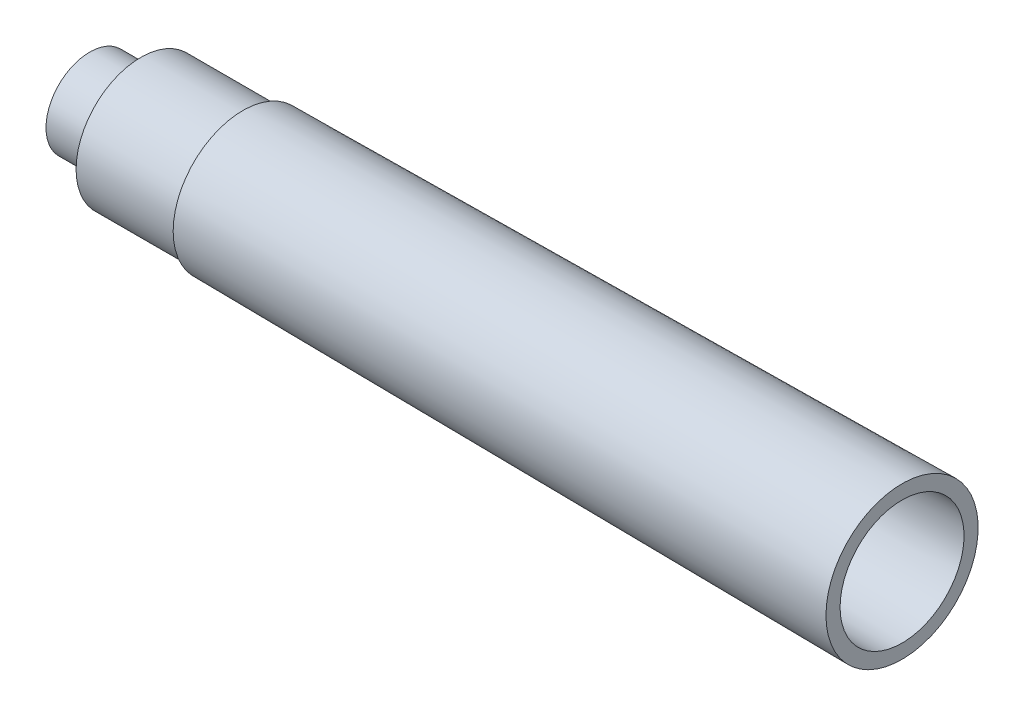
ISO-10303-21;
HEADER;
FILE_DESCRIPTION(('STEP AP214'),'2;1');
FILE_NAME('part.step','',(''),(''),'','','');
FILE_SCHEMA(('AUTOMOTIVE_DESIGN { 1 0 10303 214 1 1 1 1 }'));
ENDSEC;
DATA;
#1=APPLICATION_CONTEXT('core data for automotive mechanical design processes');
#2=APPLICATION_PROTOCOL_DEFINITION('international standard','automotive_design',2000,#1);
#3=PRODUCT_CONTEXT('',#1,'mechanical');
#4=PRODUCT('Part','Part','',(#3));
#5=PRODUCT_RELATED_PRODUCT_CATEGORY('part','',(#4));
#6=PRODUCT_DEFINITION_FORMATION('','',#4);
#7=PRODUCT_DEFINITION_CONTEXT('part definition',#1,'design');
#8=PRODUCT_DEFINITION('design','',#6,#7);
#9=PRODUCT_DEFINITION_SHAPE('','',#8);
#10=(LENGTH_UNIT() NAMED_UNIT(*) SI_UNIT(.MILLI.,.METRE.));
#11=(NAMED_UNIT(*) PLANE_ANGLE_UNIT() SI_UNIT($,.RADIAN.));
#12=(NAMED_UNIT(*) SI_UNIT($,.STERADIAN.) SOLID_ANGLE_UNIT());
#13=UNCERTAINTY_MEASURE_WITH_UNIT(LENGTH_MEASURE(1.E-05),#10,'distance_accuracy_value','');
#14=(GEOMETRIC_REPRESENTATION_CONTEXT(3) GLOBAL_UNCERTAINTY_ASSIGNED_CONTEXT((#13)) GLOBAL_UNIT_ASSIGNED_CONTEXT((#10,
#11,#12)) REPRESENTATION_CONTEXT('',''));
#15=CARTESIAN_POINT('',(0.,0.,0.));
#16=DIRECTION('',(0.,0.,1.));
#17=DIRECTION('',(1.,0.,0.));
#18=AXIS2_PLACEMENT_3D('',#15,#16,#17);
#19=CARTESIAN_POINT('',(0.465967208147707,5.75623065653714,0.));
#20=DIRECTION('',(1.,0.,0.));
#21=DIRECTION('',(0.,0.,-1.));
#22=AXIS2_PLACEMENT_3D('',#19,#20,#21);
#23=PLANE('',#22);
#24=CARTESIAN_POINT('',(0.465967208147707,3.58778917904093,0.));
#25=DIRECTION('',(-1.,0.,0.));
#26=DIRECTION('',(0.,0.,1.));
#27=AXIS2_PLACEMENT_3D('',#24,#25,#26);
#28=CIRCLE('',#27,1.81844147749621);
#29=CARTESIAN_POINT('',(0.465967208147707,3.58778917904093,1.81844147749621));
#30=VERTEX_POINT('',#29);
#31=EDGE_CURVE('E10',#30,#30,#28,.T.);
#32=ORIENTED_EDGE('',*,*,#31,.F.);
#33=EDGE_LOOP('',(#32));
#34=FACE_BOUND('',#33,.T.);
#35=CARTESIAN_POINT('',(0.465967208147706,3.58778917904093,0.));
#36=DIRECTION('',(-1.,0.,0.));
#37=DIRECTION('',(0.,0.,1.));
#38=AXIS2_PLACEMENT_3D('',#35,#36,#37);
#39=CIRCLE('',#38,2.16844147749621);
#40=CARTESIAN_POINT('',(0.465967208147706,3.58778917904093,2.16844147749621));
#41=VERTEX_POINT('',#40);
#42=EDGE_CURVE('E80',#41,#41,#39,.T.);
#43=ORIENTED_EDGE('',*,*,#42,.T.);
#44=EDGE_LOOP('',(#43));
#45=FACE_BOUND('',#44,.T.);
#46=ADVANCED_FACE('F28',(#34,#45),#23,.F.);
#47=CARTESIAN_POINT('',(0.883875689553689,3.58778917904093,0.));
#48=DIRECTION('',(-1.,0.,0.));
#49=DIRECTION('',(0.,0.,1.));
#50=AXIS2_PLACEMENT_3D('',#47,#48,#49);
#51=CYLINDRICAL_SURFACE('',#50,1.81844147749621);
#52=CARTESIAN_POINT('',(2.24662073761667,3.58778917904093,0.));
#53=DIRECTION('',(-1.,0.,0.));
#54=DIRECTION('',(0.,0.,1.));
#55=AXIS2_PLACEMENT_3D('',#52,#53,#54);
#56=CIRCLE('',#55,1.81844147749621);
#57=CARTESIAN_POINT('',(2.24662073761667,3.58778917904093,1.81844147749621));
#58=VERTEX_POINT('',#57);
#59=EDGE_CURVE('E34',#58,#58,#56,.T.);
#60=ORIENTED_EDGE('',*,*,#59,.F.);
#61=EDGE_LOOP('',(#60));
#62=FACE_BOUND('',#61,.T.);
#63=ORIENTED_EDGE('',*,*,#31,.T.);
#64=EDGE_LOOP('',(#63));
#65=FACE_BOUND('',#64,.T.);
#66=ADVANCED_FACE('F165',(#62,#65),#51,.F.);
#67=CARTESIAN_POINT('',(2.24662073761667,5.40623065653714,0.));
#68=DIRECTION('',(1.,0.,0.));
#69=DIRECTION('',(0.,0.,-1.));
#70=AXIS2_PLACEMENT_3D('',#67,#68,#69);
#71=PLANE('',#70);
#72=CARTESIAN_POINT('',(2.24662073761667,3.58778917904093,0.));
#73=DIRECTION('',(-1.,0.,0.));
#74=DIRECTION('',(0.,0.,1.));
#75=AXIS2_PLACEMENT_3D('',#72,#73,#74);
#76=CIRCLE('',#75,1.525);
#77=CARTESIAN_POINT('',(2.24662073761667,3.58778917904093,1.525));
#78=VERTEX_POINT('',#77);
#79=EDGE_CURVE('E38',#78,#78,#76,.T.);
#80=ORIENTED_EDGE('',*,*,#79,.F.);
#81=EDGE_LOOP('',(#80));
#82=FACE_BOUND('',#81,.T.);
#83=ORIENTED_EDGE('',*,*,#59,.T.);
#84=EDGE_LOOP('',(#83));
#85=FACE_BOUND('',#84,.T.);
#86=ADVANCED_FACE('F160',(#82,#85),#71,.F.);
#87=CARTESIAN_POINT('',(0.883875689553689,3.58778917904093,0.));
#88=DIRECTION('',(-1.,0.,0.));
#89=DIRECTION('',(0.,0.,1.));
#90=AXIS2_PLACEMENT_3D('',#87,#88,#89);
#91=CYLINDRICAL_SURFACE('',#90,1.525);
#92=CARTESIAN_POINT('',(0.883875689553689,3.58778917904093,0.));
#93=DIRECTION('',(-1.,0.,0.));
#94=DIRECTION('',(0.,0.,1.));
#95=AXIS2_PLACEMENT_3D('',#92,#93,#94);
#96=CIRCLE('',#95,1.525);
#97=CARTESIAN_POINT('',(0.883875689553689,3.58778917904093,1.525));
#98=VERTEX_POINT('',#97);
#99=EDGE_CURVE('E42',#98,#98,#96,.T.);
#100=ORIENTED_EDGE('',*,*,#99,.F.);
#101=EDGE_LOOP('',(#100));
#102=FACE_BOUND('',#101,.T.);
#103=ORIENTED_EDGE('',*,*,#79,.T.);
#104=EDGE_LOOP('',(#103));
#105=FACE_BOUND('',#104,.T.);
#106=ADVANCED_FACE('F154',(#102,#105),#91,.T.);
#107=CARTESIAN_POINT('',(0.883875689553689,5.11278917904093,0.));
#108=DIRECTION('',(1.,0.,0.));
#109=DIRECTION('',(0.,0.,-1.));
#110=AXIS2_PLACEMENT_3D('',#107,#108,#109);
#111=PLANE('',#110);
#112=CARTESIAN_POINT('',(0.883875689553689,3.58778917904093,0.));
#113=DIRECTION('',(-1.,0.,0.));
#114=DIRECTION('',(0.,0.,1.));
#115=AXIS2_PLACEMENT_3D('',#112,#113,#114);
#116=CIRCLE('',#115,1.175);
#117=CARTESIAN_POINT('',(0.883875689553689,3.58778917904093,1.175));
#118=VERTEX_POINT('',#117);
#119=EDGE_CURVE('E47',#118,#118,#116,.T.);
#120=ORIENTED_EDGE('',*,*,#119,.F.);
#121=EDGE_LOOP('',(#120));
#122=FACE_BOUND('',#121,.T.);
#123=ORIENTED_EDGE('',*,*,#99,.T.);
#124=EDGE_LOOP('',(#123));
#125=FACE_BOUND('',#124,.T.);
#126=ADVANCED_FACE('F148',(#122,#125),#111,.F.);
#127=CARTESIAN_POINT('',(0.883875689553689,3.58778917904093,0.));
#128=DIRECTION('',(-1.,0.,0.));
#129=DIRECTION('',(0.,0.,1.));
#130=AXIS2_PLACEMENT_3D('',#127,#128,#129);
#131=CYLINDRICAL_SURFACE('',#130,1.175);
#132=CARTESIAN_POINT('',(2.91007376605423,3.58778917904093,0.));
#133=DIRECTION('',(-1.,0.,0.));
#134=DIRECTION('',(0.,0.,1.));
#135=AXIS2_PLACEMENT_3D('',#132,#133,#134);
#136=CIRCLE('',#135,1.175);
#137=CARTESIAN_POINT('',(2.91007376605423,3.58778917904093,1.175));
#138=VERTEX_POINT('',#137);
#139=EDGE_CURVE('E50',#138,#138,#136,.T.);
#140=ORIENTED_EDGE('',*,*,#139,.F.);
#141=EDGE_LOOP('',(#140));
#142=FACE_BOUND('',#141,.T.);
#143=ORIENTED_EDGE('',*,*,#119,.T.);
#144=EDGE_LOOP('',(#143));
#145=FACE_BOUND('',#144,.T.);
#146=ADVANCED_FACE('F142',(#142,#145),#131,.F.);
#147=CARTESIAN_POINT('',(2.91007376605423,3.58778917904093,0.));
#148=DIRECTION('',(1.,0.,0.));
#149=DIRECTION('',(0.,0.,-1.));
#150=AXIS2_PLACEMENT_3D('',#147,#148,#149);
#151=CONICAL_SURFACE('',#150,1.175,1.17566067826737);
#152=CARTESIAN_POINT('',(3.46686364129525,3.58778917904093,0.));
#153=DIRECTION('',(-1.,0.,0.));
#154=DIRECTION('',(0.,0.,1.));
#155=AXIS2_PLACEMENT_3D('',#152,#153,#154);
#156=CIRCLE('',#155,2.51);
#157=CARTESIAN_POINT('',(3.46686364129525,3.58778917904093,2.51));
#158=VERTEX_POINT('',#157);
#159=EDGE_CURVE('E53',#158,#158,#156,.T.);
#160=ORIENTED_EDGE('',*,*,#159,.F.);
#161=EDGE_LOOP('',(#160));
#162=FACE_BOUND('',#161,.T.);
#163=ORIENTED_EDGE('',*,*,#139,.T.);
#164=EDGE_LOOP('',(#163));
#165=FACE_BOUND('',#164,.T.);
#166=ADVANCED_FACE('F136',(#162,#165),#151,.F.);
#167=CARTESIAN_POINT('',(0.883875689553689,3.58778917904093,0.));
#168=DIRECTION('',(-1.,0.,0.));
#169=DIRECTION('',(0.,0.,1.));
#170=AXIS2_PLACEMENT_3D('',#167,#168,#169);
#171=CYLINDRICAL_SURFACE('',#170,2.51);
#172=CARTESIAN_POINT('',(8.76596720814771,3.58778917904093,0.));
#173=DIRECTION('',(-1.,0.,0.));
#174=DIRECTION('',(0.,0.,1.));
#175=AXIS2_PLACEMENT_3D('',#172,#173,#174);
#176=CIRCLE('',#175,2.51);
#177=CARTESIAN_POINT('',(8.76596720814771,3.58778917904093,2.51));
#178=VERTEX_POINT('',#177);
#179=EDGE_CURVE('E56',#178,#178,#176,.T.);
#180=ORIENTED_EDGE('',*,*,#179,.F.);
#181=EDGE_LOOP('',(#180));
#182=FACE_BOUND('',#181,.T.);
#183=ORIENTED_EDGE('',*,*,#159,.T.);
#184=EDGE_LOOP('',(#183));
#185=FACE_BOUND('',#184,.T.);
#186=ADVANCED_FACE('F130',(#182,#185),#171,.F.);
#187=CARTESIAN_POINT('',(8.7659672081477,6.09778917904093,0.));
#188=DIRECTION('',(-1.,0.,0.));
#189=DIRECTION('',(0.,0.,1.));
#190=AXIS2_PLACEMENT_3D('',#187,#188,#189);
#191=PLANE('',#190);
#192=CARTESIAN_POINT('',(8.7659672081477,3.58778917904093,0.));
#193=DIRECTION('',(-1.,0.,0.));
#194=DIRECTION('',(0.,0.,1.));
#195=AXIS2_PLACEMENT_3D('',#192,#193,#194);
#196=CIRCLE('',#195,2.76);
#197=CARTESIAN_POINT('',(8.7659672081477,3.58778917904093,2.76));
#198=VERTEX_POINT('',#197);
#199=EDGE_CURVE('E59',#198,#198,#196,.T.);
#200=ORIENTED_EDGE('',*,*,#199,.F.);
#201=EDGE_LOOP('',(#200));
#202=FACE_BOUND('',#201,.T.);
#203=ORIENTED_EDGE('',*,*,#179,.T.);
#204=EDGE_LOOP('',(#203));
#205=FACE_BOUND('',#204,.T.);
#206=ADVANCED_FACE('F124',(#202,#205),#191,.F.);
#207=CARTESIAN_POINT('',(8.7659672081477,3.58778917904093,0.));
#208=DIRECTION('',(1.,0.,0.));
#209=DIRECTION('',(0.,0.,-1.));
#210=AXIS2_PLACEMENT_3D('',#207,#208,#209);
#211=CONICAL_SURFACE('',#210,2.76,0.00984343206728188);
#212=CARTESIAN_POINT('',(40.7659672081477,3.58778917904093,0.));
#213=DIRECTION('',(-1.,0.,0.));
#214=DIRECTION('',(0.,0.,1.));
#215=AXIS2_PLACEMENT_3D('',#212,#213,#214);
#216=CIRCLE('',#215,3.075);
#217=CARTESIAN_POINT('',(40.7659672081477,3.58778917904093,3.075));
#218=VERTEX_POINT('',#217);
#219=EDGE_CURVE('E62',#218,#218,#216,.T.);
#220=ORIENTED_EDGE('',*,*,#219,.F.);
#221=EDGE_LOOP('',(#220));
#222=FACE_BOUND('',#221,.T.);
#223=ORIENTED_EDGE('',*,*,#199,.T.);
#224=EDGE_LOOP('',(#223));
#225=FACE_BOUND('',#224,.T.);
#226=ADVANCED_FACE('F118',(#222,#225),#211,.F.);
#227=CARTESIAN_POINT('',(40.7659672081477,7.36278917904093,0.));
#228=DIRECTION('',(-1.,0.,0.));
#229=DIRECTION('',(0.,0.,1.));
#230=AXIS2_PLACEMENT_3D('',#227,#228,#229);
#231=PLANE('',#230);
#232=CARTESIAN_POINT('',(40.7659672081477,3.58778917904093,0.));
#233=DIRECTION('',(-1.,0.,0.));
#234=DIRECTION('',(0.,0.,1.));
#235=AXIS2_PLACEMENT_3D('',#232,#233,#234);
#236=CIRCLE('',#235,3.775);
#237=CARTESIAN_POINT('',(40.7659672081477,3.58778917904093,3.775));
#238=VERTEX_POINT('',#237);
#239=EDGE_CURVE('E65',#238,#238,#236,.T.);
#240=ORIENTED_EDGE('',*,*,#239,.F.);
#241=EDGE_LOOP('',(#240));
#242=FACE_BOUND('',#241,.T.);
#243=ORIENTED_EDGE('',*,*,#219,.T.);
#244=EDGE_LOOP('',(#243));
#245=FACE_BOUND('',#244,.T.);
#246=ADVANCED_FACE('F112',(#242,#245),#231,.F.);
#247=CARTESIAN_POINT('',(40.7659672081477,3.58778917904093,0.));
#248=DIRECTION('',(1.,0.,0.));
#249=DIRECTION('',(0.,0.,-1.));
#250=AXIS2_PLACEMENT_3D('',#247,#248,#249);
#251=CONICAL_SURFACE('',#250,3.775,0.0096327295732242);
#252=CARTESIAN_POINT('',(8.0659672081477,3.58778917904093,0.));
#253=DIRECTION('',(-1.,0.,0.));
#254=DIRECTION('',(0.,0.,1.));
#255=AXIS2_PLACEMENT_3D('',#252,#253,#254);
#256=CIRCLE('',#255,3.46);
#257=CARTESIAN_POINT('',(8.0659672081477,3.58778917904093,3.46));
#258=VERTEX_POINT('',#257);
#259=EDGE_CURVE('E68',#258,#258,#256,.T.);
#260=ORIENTED_EDGE('',*,*,#259,.F.);
#261=EDGE_LOOP('',(#260));
#262=FACE_BOUND('',#261,.T.);
#263=ORIENTED_EDGE('',*,*,#239,.T.);
#264=EDGE_LOOP('',(#263));
#265=FACE_BOUND('',#264,.T.);
#266=ADVANCED_FACE('F106',(#262,#265),#251,.T.);
#267=CARTESIAN_POINT('',(8.0659672081477,6.79778917904093,0.));
#268=DIRECTION('',(1.,0.,0.));
#269=DIRECTION('',(0.,0.,-1.));
#270=AXIS2_PLACEMENT_3D('',#267,#268,#269);
#271=PLANE('',#270);
#272=CARTESIAN_POINT('',(8.06596720814771,3.58778917904093,0.));
#273=DIRECTION('',(-1.,0.,0.));
#274=DIRECTION('',(0.,0.,1.));
#275=AXIS2_PLACEMENT_3D('',#272,#273,#274);
#276=CIRCLE('',#275,3.21);
#277=CARTESIAN_POINT('',(8.06596720814771,3.58778917904093,3.21));
#278=VERTEX_POINT('',#277);
#279=EDGE_CURVE('E71',#278,#278,#276,.T.);
#280=ORIENTED_EDGE('',*,*,#279,.F.);
#281=EDGE_LOOP('',(#280));
#282=FACE_BOUND('',#281,.T.);
#283=ORIENTED_EDGE('',*,*,#259,.T.);
#284=EDGE_LOOP('',(#283));
#285=FACE_BOUND('',#284,.T.);
#286=ADVANCED_FACE('F100',(#282,#285),#271,.F.);
#287=CARTESIAN_POINT('',(0.883875689553689,3.58778917904093,0.));
#288=DIRECTION('',(-1.,0.,0.));
#289=DIRECTION('',(0.,0.,1.));
#290=AXIS2_PLACEMENT_3D('',#287,#288,#289);
#291=CYLINDRICAL_SURFACE('',#290,3.21);
#292=CARTESIAN_POINT('',(3.00037113309236,3.58778917904093,0.));
#293=DIRECTION('',(-1.,0.,0.));
#294=DIRECTION('',(0.,0.,1.));
#295=AXIS2_PLACEMENT_3D('',#292,#293,#294);
#296=CIRCLE('',#295,3.21);
#297=CARTESIAN_POINT('',(3.00037113309236,3.58778917904093,3.21));
#298=VERTEX_POINT('',#297);
#299=EDGE_CURVE('E74',#298,#298,#296,.T.);
#300=ORIENTED_EDGE('',*,*,#299,.F.);
#301=EDGE_LOOP('',(#300));
#302=FACE_BOUND('',#301,.T.);
#303=ORIENTED_EDGE('',*,*,#279,.T.);
#304=EDGE_LOOP('',(#303));
#305=FACE_BOUND('',#304,.T.);
#306=ADVANCED_FACE('F94',(#302,#305),#291,.T.);
#307=CARTESIAN_POINT('',(3.00037113309236,3.58778917904093,0.));
#308=DIRECTION('',(1.,0.,0.));
#309=DIRECTION('',(0.,0.,-1.));
#310=AXIS2_PLACEMENT_3D('',#307,#308,#309);
#311=CONICAL_SURFACE('',#310,3.21,1.17566067826737);
#312=CARTESIAN_POINT('',(2.56596720814771,3.58778917904093,0.));
#313=DIRECTION('',(-1.,0.,0.));
#314=DIRECTION('',(0.,0.,1.));
#315=AXIS2_PLACEMENT_3D('',#312,#313,#314);
#316=CIRCLE('',#315,2.16844147749621);
#317=CARTESIAN_POINT('',(2.56596720814771,3.58778917904093,2.16844147749621));
#318=VERTEX_POINT('',#317);
#319=EDGE_CURVE('E77',#318,#318,#316,.T.);
#320=ORIENTED_EDGE('',*,*,#319,.F.);
#321=EDGE_LOOP('',(#320));
#322=FACE_BOUND('',#321,.T.);
#323=ORIENTED_EDGE('',*,*,#299,.T.);
#324=EDGE_LOOP('',(#323));
#325=FACE_BOUND('',#324,.T.);
#326=ADVANCED_FACE('F88',(#322,#325),#311,.T.);
#327=CARTESIAN_POINT('',(0.883875689553689,3.58778917904093,0.));
#328=DIRECTION('',(-1.,0.,0.));
#329=DIRECTION('',(0.,0.,1.));
#330=AXIS2_PLACEMENT_3D('',#327,#328,#329);
#331=CYLINDRICAL_SURFACE('',#330,2.16844147749621);
#332=ORIENTED_EDGE('',*,*,#42,.F.);
#333=EDGE_LOOP('',(#332));
#334=FACE_BOUND('',#333,.T.);
#335=ORIENTED_EDGE('',*,*,#319,.T.);
#336=EDGE_LOOP('',(#335));
#337=FACE_BOUND('',#336,.T.);
#338=ADVANCED_FACE('F85',(#334,#337),#331,.T.);
#339=CLOSED_SHELL('',(#46,#66,#86,#106,#126,#146,#166,#186,#206,#226,#246,#266,#286,#306,#326,#338));
#340=MANIFOLD_SOLID_BREP('B2',#339);
#341=ADVANCED_BREP_SHAPE_REPRESENTATION('',(#18,#340),#14);
#342=SHAPE_DEFINITION_REPRESENTATION(#9,#341);
ENDSEC;
END-ISO-10303-21;
